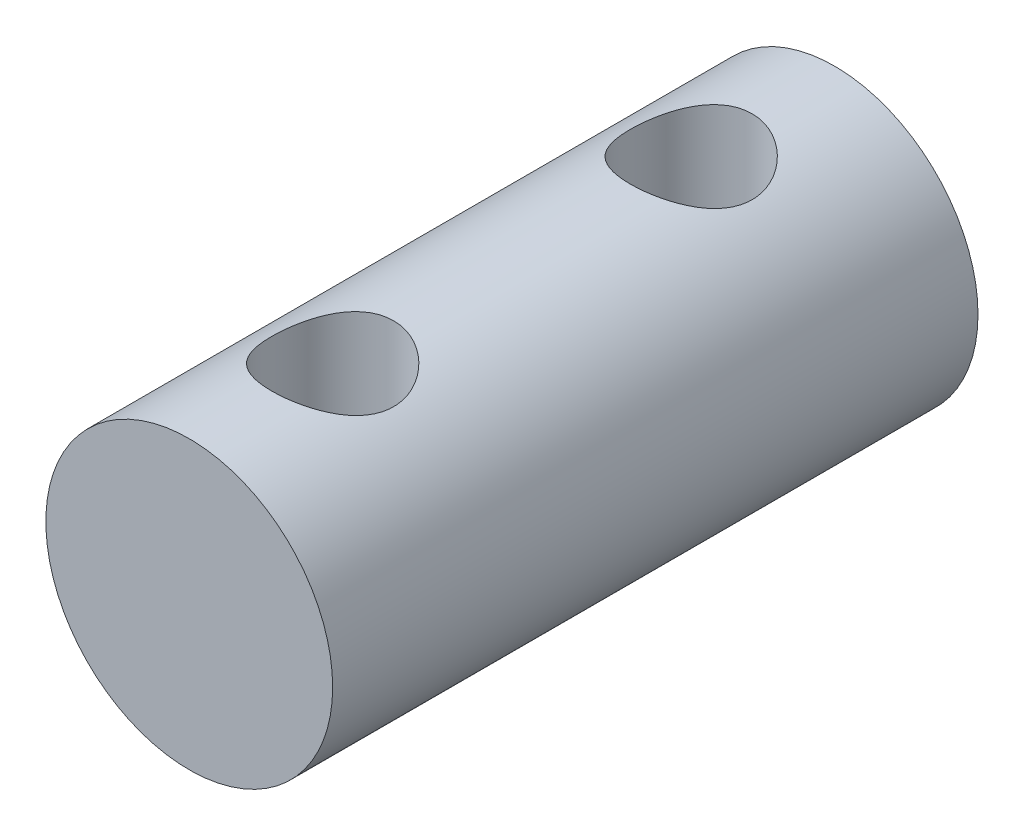
ISO-10303-21;
HEADER;
FILE_DESCRIPTION(('STEP AP214'),'2;1');
FILE_NAME('part.step','',(''),(''),'','','');
FILE_SCHEMA(('AUTOMOTIVE_DESIGN { 1 0 10303 214 1 1 1 1 }'));
ENDSEC;
DATA;
#1=APPLICATION_CONTEXT('core data for automotive mechanical design processes');
#2=APPLICATION_PROTOCOL_DEFINITION('international standard','automotive_design',2000,#1);
#3=PRODUCT_CONTEXT('',#1,'mechanical');
#4=PRODUCT('Part','Part','',(#3));
#5=PRODUCT_RELATED_PRODUCT_CATEGORY('part','',(#4));
#6=PRODUCT_DEFINITION_FORMATION('','',#4);
#7=PRODUCT_DEFINITION_CONTEXT('part definition',#1,'design');
#8=PRODUCT_DEFINITION('design','',#6,#7);
#9=PRODUCT_DEFINITION_SHAPE('','',#8);
#10=(LENGTH_UNIT() NAMED_UNIT(*) SI_UNIT(.MILLI.,.METRE.));
#11=(NAMED_UNIT(*) PLANE_ANGLE_UNIT() SI_UNIT($,.RADIAN.));
#12=(NAMED_UNIT(*) SI_UNIT($,.STERADIAN.) SOLID_ANGLE_UNIT());
#13=UNCERTAINTY_MEASURE_WITH_UNIT(LENGTH_MEASURE(1.E-05),#10,'distance_accuracy_value','');
#14=(GEOMETRIC_REPRESENTATION_CONTEXT(3) GLOBAL_UNCERTAINTY_ASSIGNED_CONTEXT((#13)) GLOBAL_UNIT_ASSIGNED_CONTEXT((#10,
#11,#12)) REPRESENTATION_CONTEXT('',''));
#15=CARTESIAN_POINT('',(0.,0.,0.));
#16=DIRECTION('',(0.,0.,1.));
#17=DIRECTION('',(1.,0.,0.));
#18=AXIS2_PLACEMENT_3D('',#15,#16,#17);
#19=CARTESIAN_POINT('',(0.,0.,18.));
#20=DIRECTION('',(0.,0.,-1.));
#21=DIRECTION('',(-1.,0.,0.));
#22=AXIS2_PLACEMENT_3D('',#19,#20,#21);
#23=CYLINDRICAL_SURFACE('',#22,4.);
#24=CARTESIAN_POINT('',(0.,-4.,15.7));
#25=CARTESIAN_POINT('',(0.0909067383912382,-3.99999220597041,15.6999897106301));
#26=CARTESIAN_POINT('',(0.181948247544875,-3.99686535628648,15.6926652180497));
#27=CARTESIAN_POINT('',(0.361443817461365,-3.98465863926745,15.6636311393432));
#28=CARTESIAN_POINT('',(0.449890675673104,-3.9755635876372,15.6418848598116));
#29=CARTESIAN_POINT('',(0.621303418382836,-3.95239600576765,15.5849624150777));
#30=CARTESIAN_POINT('',(0.704287032203665,-3.93834062442321,15.5498324870813));
#31=CARTESIAN_POINT('',(0.863099993382739,-3.90661303424537,15.4673347121455));
#32=CARTESIAN_POINT('',(0.938931339683007,-3.88894184037472,15.4199702984635));
#33=CARTESIAN_POINT('',(1.08533887118012,-3.85071852141569,15.3117595210581));
#34=CARTESIAN_POINT('',(1.15549620225715,-3.83006960280207,15.2503809742659));
#35=CARTESIAN_POINT('',(1.28488425592701,-3.78862734806511,15.1170106760215));
#36=CARTESIAN_POINT('',(1.34410900804107,-3.76783393942688,15.0450131637426));
#37=CARTESIAN_POINT('',(1.45297914161399,-3.72725158425048,14.8879432656646));
#38=CARTESIAN_POINT('',(1.50197144957215,-3.70757005023861,14.8023875229588));
#39=CARTESIAN_POINT('',(1.58468252966002,-3.67298326222159,14.6232937969467));
#40=CARTESIAN_POINT('',(1.61840948248621,-3.6580754512366,14.5297601210278));
#41=CARTESIAN_POINT('',(1.66788510104617,-3.63577599564205,14.3421874156549));
#42=CARTESIAN_POINT('',(1.68444164210522,-3.62804858539708,14.2484029755593));
#43=CARTESIAN_POINT('',(1.70162480860733,-3.62002384663305,14.0590933740614));
#44=CARTESIAN_POINT('',(1.70226073757513,-3.61972217873622,13.9635692619356));
#45=CARTESIAN_POINT('',(1.68819130162689,-3.62630002474142,13.7816927718962));
#46=CARTESIAN_POINT('',(1.6747147959927,-3.63260434164112,13.6952202789216));
#47=CARTESIAN_POINT('',(1.63487058638114,-3.65070840844882,13.5259057915921));
#48=CARTESIAN_POINT('',(1.60850029417696,-3.66250926167832,13.4430645297897));
#49=CARTESIAN_POINT('',(1.5430988475594,-3.69054609418257,13.281229181224));
#50=CARTESIAN_POINT('',(1.50380571381535,-3.70687264164878,13.2023573651418));
#51=CARTESIAN_POINT('',(1.41386001526362,-3.74210223346658,13.0520118896411));
#52=CARTESIAN_POINT('',(1.36320287222268,-3.76100631502547,12.9805412289449));
#53=CARTESIAN_POINT('',(1.2467214443949,-3.80128969459956,12.8403869615859));
#54=CARTESIAN_POINT('',(1.179953093145,-3.82274019222962,12.7725061461591));
#55=CARTESIAN_POINT('',(1.0357766835901,-3.86429704947114,12.6486294608835));
#56=CARTESIAN_POINT('',(0.958365937572639,-3.88440306762471,12.5926366024286));
#57=CARTESIAN_POINT('',(0.792578450005453,-3.92163290268784,12.4928824694364));
#58=CARTESIAN_POINT('',(0.703976692649453,-3.93867002040557,12.4494603886675));
#59=CARTESIAN_POINT('',(0.519816535420781,-3.96717150105244,12.378421998336));
#60=CARTESIAN_POINT('',(0.424262175462369,-3.97863907098317,12.3507965912606));
#61=CARTESIAN_POINT('',(0.235607210966909,-3.99410277532845,12.3138452407294));
#62=CARTESIAN_POINT('',(0.142753433781745,-3.99853766037867,12.3034427183361));
#63=CARTESIAN_POINT('',(-0.0434719300977839,-4.00084626519537,12.2980071221176));
#64=CARTESIAN_POINT('',(-0.136843351894631,-3.99872196660535,12.3029694063182));
#65=CARTESIAN_POINT('',(-0.31632812610938,-3.9884337975937,12.3273632165539));
#66=CARTESIAN_POINT('',(-0.402566216761334,-3.98059025078653,12.3460276750595));
#67=CARTESIAN_POINT('',(-0.570585652286979,-3.96000012032105,12.3962161277042));
#68=CARTESIAN_POINT('',(-0.652366438467557,-3.94725292362944,12.4277417297181));
#69=CARTESIAN_POINT('',(-0.812034318548236,-3.91757618822361,12.5037834101923));
#70=CARTESIAN_POINT('',(-0.889720370209442,-3.9005285877614,12.5486740423999));
#71=CARTESIAN_POINT('',(-1.03673648824899,-3.86405536635233,12.6497613985467));
#72=CARTESIAN_POINT('',(-1.10606298906366,-3.84462873775923,12.7059629197849));
#73=CARTESIAN_POINT('',(-1.23980420956813,-3.80369998966484,12.8329498484284));
#74=CARTESIAN_POINT('',(-1.30347271839269,-3.78215082847771,12.9045079835753));
#75=CARTESIAN_POINT('',(-1.41811853281525,-3.74067716848582,13.0576154101855));
#76=CARTESIAN_POINT('',(-1.46909251076311,-3.7207530965884,13.1391673129996));
#77=CARTESIAN_POINT('',(-1.5575812751315,-3.6845994787195,13.3118820164696));
#78=CARTESIAN_POINT('',(-1.59485563043623,-3.66843760396252,13.4031832312083));
#79=CARTESIAN_POINT('',(-1.65317215153204,-3.64253466336686,13.5916722222724));
#80=CARTESIAN_POINT('',(-1.6742284343492,-3.63278801447038,13.6888547994951));
#81=CARTESIAN_POINT('',(-1.6980817865036,-3.62169510113298,13.8780341003724));
#82=CARTESIAN_POINT('',(-1.70219594466855,-3.61974326789463,13.9698298699793));
#83=CARTESIAN_POINT('',(-1.69559342985225,-3.62284103372561,14.152756294801));
#84=CARTESIAN_POINT('',(-1.68487926513445,-3.62788944867838,14.2438870598827));
#85=CARTESIAN_POINT('',(-1.65004520545517,-3.64385594943718,14.418154377575));
#86=CARTESIAN_POINT('',(-1.62662781472624,-3.65446553868685,14.5014623813539));
#87=CARTESIAN_POINT('',(-1.56775451171664,-3.68010476578384,14.6629780659228));
#88=CARTESIAN_POINT('',(-1.5322951887417,-3.69513565573577,14.741184294223));
#89=CARTESIAN_POINT('',(-1.44784032686706,-3.72906792770947,14.8955258125194));
#90=CARTESIAN_POINT('',(-1.39814701464036,-3.74815036482766,14.9712386929264));
#91=CARTESIAN_POINT('',(-1.28759066878811,-3.78755219655615,15.1136625277544));
#92=CARTESIAN_POINT('',(-1.22672351574411,-3.80787204550609,15.1803701464476));
#93=CARTESIAN_POINT('',(-1.08998592064412,-3.84933921665509,15.308184663993));
#94=CARTESIAN_POINT('',(-1.01332080388046,-3.87042965397422,15.3684639434664));
#95=CARTESIAN_POINT('',(-0.850192328366723,-3.90950085981833,15.4753572184503));
#96=CARTESIAN_POINT('',(-0.763724549019843,-3.92748021606687,15.521965014425));
#97=CARTESIAN_POINT('',(-0.584638322061837,-3.95807109121892,15.5992398277168));
#98=CARTESIAN_POINT('',(-0.492133369486678,-3.97076006232551,15.6301384218695));
#99=CARTESIAN_POINT('',(-0.302747237251516,-3.98965231477193,15.6756391142457));
#100=CARTESIAN_POINT('',(-0.205880644982406,-3.99587575072494,15.6902918642927));
#101=CARTESIAN_POINT('',(-0.0724124000644841,-3.9995111552704,15.6988472918178));
#102=CARTESIAN_POINT('',(-0.0362168954062223,-4.00000310511145,15.7000040992454));
#103=CARTESIAN_POINT('',(0.,-4.,15.7));
#104=B_SPLINE_CURVE_WITH_KNOTS('',3,(#24,#25,#26,#27,#28,#29,#30,#31,#32,#33,#34,#35,#36,#37,
#38,#39,#40,#41,#42,#43,#44,#45,#46,#47,#48,#49,#50,#51,#52,#53,#54,#55,#56,#57,#58,#59,#60,#61,
#62,#63,#64,#65,#66,#67,#68,#69,#70,#71,#72,#73,#74,#75,#76,#77,#78,#79,#80,#81,#82,#83,#84,#85,
#86,#87,#88,#89,#90,#91,#92,#93,#94,#95,#96,#97,#98,#99,#100,#101,#102,#103),.UNSPECIFIED.,.T.,
.F.,(4,2,2,2,2,2,2,2,2,2,2,2,2,2,2,2,2,2,2,2,2,2,2,2,2,2,2,2,2,2,2,2,2,2,2,2,2,2,2,4),(0.,
0.272614080586948,0.545924448955115,0.818299036258468,1.0905972723283,1.37578897563167,
1.6611359694513,1.96122665765481,2.26115633643809,2.54622741570577,2.83113190415595,
3.09313885870025,3.35519842866463,3.62293686689447,3.89078336358892,4.18227106535257,
4.47383251736207,4.77265212568181,5.07129946606979,5.35045690028007,5.62953000442511,
5.89406804870765,6.15863917515647,6.43146346064616,6.70440370416334,6.99759736979758,
7.29086781033873,7.589063837357,7.88700000529106,8.16127896953774,8.4355115441941,
8.69592961746399,8.95642151179745,9.23291696910161,9.5095145664191,9.80742506459498,
10.1054704465792,10.3989846098609,10.691581048933,10.80018945154),.UNSPECIFIED.);
#105=CARTESIAN_POINT('',(0.,-4.,15.7));
#106=VERTEX_POINT('',#105);
#107=EDGE_CURVE('E32',#106,#106,#104,.T.);
#108=ORIENTED_EDGE('',*,*,#107,.T.);
#109=EDGE_LOOP('',(#108));
#110=FACE_BOUND('',#109,.T.);
#111=CARTESIAN_POINT('',(0.,4.,15.7));
#112=CARTESIAN_POINT('',(-0.0909067383912382,3.99999220597041,15.6999897106301));
#113=CARTESIAN_POINT('',(-0.181948247544875,3.99686535628648,15.6926652180497));
#114=CARTESIAN_POINT('',(-0.361443817461365,3.98465863926745,15.6636311393432));
#115=CARTESIAN_POINT('',(-0.449890675673104,3.9755635876372,15.6418848598116));
#116=CARTESIAN_POINT('',(-0.621303418382836,3.95239600576765,15.5849624150777));
#117=CARTESIAN_POINT('',(-0.704287032203665,3.93834062442321,15.5498324870813));
#118=CARTESIAN_POINT('',(-0.863099993382739,3.90661303424537,15.4673347121455));
#119=CARTESIAN_POINT('',(-0.938931339683007,3.88894184037472,15.4199702984635));
#120=CARTESIAN_POINT('',(-1.08533887118012,3.85071852141569,15.3117595210581));
#121=CARTESIAN_POINT('',(-1.15549620225715,3.83006960280207,15.2503809742659));
#122=CARTESIAN_POINT('',(-1.28488425592701,3.78862734806511,15.1170106760215));
#123=CARTESIAN_POINT('',(-1.34410900804107,3.76783393942688,15.0450131637426));
#124=CARTESIAN_POINT('',(-1.45297914161399,3.72725158425048,14.8879432656646));
#125=CARTESIAN_POINT('',(-1.50197144957215,3.70757005023861,14.8023875229588));
#126=CARTESIAN_POINT('',(-1.58468252966002,3.67298326222159,14.6232937969467));
#127=CARTESIAN_POINT('',(-1.61840948248621,3.6580754512366,14.5297601210278));
#128=CARTESIAN_POINT('',(-1.66788510104617,3.63577599564205,14.3421874156549));
#129=CARTESIAN_POINT('',(-1.68444164210522,3.62804858539708,14.2484029755593));
#130=CARTESIAN_POINT('',(-1.70162480860733,3.62002384663305,14.0590933740614));
#131=CARTESIAN_POINT('',(-1.70226073757513,3.61972217873622,13.9635692619356));
#132=CARTESIAN_POINT('',(-1.68819130162689,3.62630002474142,13.7816927718962));
#133=CARTESIAN_POINT('',(-1.6747147959927,3.63260434164112,13.6952202789216));
#134=CARTESIAN_POINT('',(-1.63487058638114,3.65070840844882,13.5259057915921));
#135=CARTESIAN_POINT('',(-1.60850029417696,3.66250926167832,13.4430645297897));
#136=CARTESIAN_POINT('',(-1.5430988475594,3.69054609418257,13.281229181224));
#137=CARTESIAN_POINT('',(-1.50380571381535,3.70687264164878,13.2023573651418));
#138=CARTESIAN_POINT('',(-1.41386001526362,3.74210223346658,13.0520118896411));
#139=CARTESIAN_POINT('',(-1.36320287222268,3.76100631502547,12.9805412289449));
#140=CARTESIAN_POINT('',(-1.2467214443949,3.80128969459956,12.8403869615859));
#141=CARTESIAN_POINT('',(-1.179953093145,3.82274019222962,12.7725061461591));
#142=CARTESIAN_POINT('',(-1.0357766835901,3.86429704947114,12.6486294608835));
#143=CARTESIAN_POINT('',(-0.958365937572639,3.88440306762471,12.5926366024286));
#144=CARTESIAN_POINT('',(-0.792578450005453,3.92163290268784,12.4928824694364));
#145=CARTESIAN_POINT('',(-0.703976692649453,3.93867002040557,12.4494603886675));
#146=CARTESIAN_POINT('',(-0.519816535420781,3.96717150105244,12.378421998336));
#147=CARTESIAN_POINT('',(-0.424262175462369,3.97863907098317,12.3507965912606));
#148=CARTESIAN_POINT('',(-0.235607210966909,3.99410277532845,12.3138452407294));
#149=CARTESIAN_POINT('',(-0.142753433781745,3.99853766037867,12.3034427183361));
#150=CARTESIAN_POINT('',(0.0434719300977839,4.00084626519537,12.2980071221176));
#151=CARTESIAN_POINT('',(0.136843351894631,3.99872196660535,12.3029694063182));
#152=CARTESIAN_POINT('',(0.31632812610938,3.9884337975937,12.3273632165539));
#153=CARTESIAN_POINT('',(0.402566216761334,3.98059025078653,12.3460276750595));
#154=CARTESIAN_POINT('',(0.570585652286979,3.96000012032105,12.3962161277042));
#155=CARTESIAN_POINT('',(0.652366438467557,3.94725292362944,12.4277417297181));
#156=CARTESIAN_POINT('',(0.812034318548236,3.91757618822361,12.5037834101923));
#157=CARTESIAN_POINT('',(0.889720370209442,3.9005285877614,12.5486740423999));
#158=CARTESIAN_POINT('',(1.03673648824899,3.86405536635233,12.6497613985467));
#159=CARTESIAN_POINT('',(1.10606298906366,3.84462873775923,12.7059629197849));
#160=CARTESIAN_POINT('',(1.23980420956813,3.80369998966484,12.8329498484284));
#161=CARTESIAN_POINT('',(1.30347271839269,3.78215082847771,12.9045079835753));
#162=CARTESIAN_POINT('',(1.41811853281525,3.74067716848582,13.0576154101855));
#163=CARTESIAN_POINT('',(1.46909251076311,3.7207530965884,13.1391673129996));
#164=CARTESIAN_POINT('',(1.5575812751315,3.6845994787195,13.3118820164696));
#165=CARTESIAN_POINT('',(1.59485563043623,3.66843760396252,13.4031832312083));
#166=CARTESIAN_POINT('',(1.65317215153204,3.64253466336686,13.5916722222724));
#167=CARTESIAN_POINT('',(1.6742284343492,3.63278801447038,13.6888547994951));
#168=CARTESIAN_POINT('',(1.6980817865036,3.62169510113298,13.8780341003724));
#169=CARTESIAN_POINT('',(1.70219594466855,3.61974326789463,13.9698298699793));
#170=CARTESIAN_POINT('',(1.69559342985225,3.62284103372561,14.152756294801));
#171=CARTESIAN_POINT('',(1.68487926513445,3.62788944867838,14.2438870598827));
#172=CARTESIAN_POINT('',(1.65004520545517,3.64385594943718,14.418154377575));
#173=CARTESIAN_POINT('',(1.62662781472624,3.65446553868685,14.5014623813539));
#174=CARTESIAN_POINT('',(1.56775451171664,3.68010476578384,14.6629780659228));
#175=CARTESIAN_POINT('',(1.5322951887417,3.69513565573577,14.741184294223));
#176=CARTESIAN_POINT('',(1.44784032686706,3.72906792770947,14.8955258125194));
#177=CARTESIAN_POINT('',(1.39814701464036,3.74815036482766,14.9712386929264));
#178=CARTESIAN_POINT('',(1.28759066878811,3.78755219655615,15.1136625277544));
#179=CARTESIAN_POINT('',(1.22672351574411,3.80787204550609,15.1803701464476));
#180=CARTESIAN_POINT('',(1.08998592064412,3.84933921665509,15.308184663993));
#181=CARTESIAN_POINT('',(1.01332080388046,3.87042965397422,15.3684639434664));
#182=CARTESIAN_POINT('',(0.850192328366723,3.90950085981833,15.4753572184503));
#183=CARTESIAN_POINT('',(0.763724549019843,3.92748021606687,15.521965014425));
#184=CARTESIAN_POINT('',(0.584638322061837,3.95807109121892,15.5992398277168));
#185=CARTESIAN_POINT('',(0.492133369486678,3.97076006232551,15.6301384218695));
#186=CARTESIAN_POINT('',(0.302747237251516,3.98965231477193,15.6756391142457));
#187=CARTESIAN_POINT('',(0.205880644982406,3.99587575072494,15.6902918642927));
#188=CARTESIAN_POINT('',(0.0724124000644841,3.9995111552704,15.6988472918178));
#189=CARTESIAN_POINT('',(0.0362168954062223,4.00000310511145,15.7000040992454));
#190=CARTESIAN_POINT('',(0.,4.,15.7));
#191=B_SPLINE_CURVE_WITH_KNOTS('',3,(#111,#112,#113,#114,#115,#116,#117,#118,#119,#120,#121,
#122,#123,#124,#125,#126,#127,#128,#129,#130,#131,#132,#133,#134,#135,#136,#137,#138,#139,#140,
#141,#142,#143,#144,#145,#146,#147,#148,#149,#150,#151,#152,#153,#154,#155,#156,#157,#158,#159,
#160,#161,#162,#163,#164,#165,#166,#167,#168,#169,#170,#171,#172,#173,#174,#175,#176,#177,#178,
#179,#180,#181,#182,#183,#184,#185,#186,#187,#188,#189,#190),.UNSPECIFIED.,.T.,.F.,(4,2,2,2,2,2,
2,2,2,2,2,2,2,2,2,2,2,2,2,2,2,2,2,2,2,2,2,2,2,2,2,2,2,2,2,2,2,2,2,4),(0.,0.272614080586948,
0.545924448955115,0.818299036258468,1.0905972723283,1.37578897563167,1.6611359694513,
1.96122665765481,2.26115633643809,2.54622741570577,2.83113190415595,3.09313885870025,
3.35519842866463,3.62293686689447,3.89078336358892,4.18227106535257,4.47383251736207,
4.77265212568181,5.07129946606979,5.35045690028007,5.62953000442511,5.89406804870765,
6.15863917515647,6.43146346064616,6.70440370416334,6.99759736979758,7.29086781033873,
7.589063837357,7.88700000529106,8.16127896953774,8.4355115441941,8.69592961746399,
8.95642151179745,9.23291696910161,9.5095145664191,9.80742506459498,10.1054704465792,
10.3989846098609,10.691581048933,10.80018945154),.UNSPECIFIED.);
#192=CARTESIAN_POINT('',(0.,4.,15.7));
#193=VERTEX_POINT('',#192);
#194=EDGE_CURVE('E80',#193,#193,#191,.T.);
#195=ORIENTED_EDGE('',*,*,#194,.T.);
#196=EDGE_LOOP('',(#195));
#197=FACE_BOUND('',#196,.T.);
#198=CARTESIAN_POINT('',(0.,-4.,5.7));
#199=CARTESIAN_POINT('',(0.0909067383912385,-3.99999220597041,5.69998971063012));
#200=CARTESIAN_POINT('',(0.181948247544875,-3.99686535628648,5.69266521804974));
#201=CARTESIAN_POINT('',(0.361443817461365,-3.98465863926745,5.66363113934321));
#202=CARTESIAN_POINT('',(0.449890675673104,-3.9755635876372,5.64188485981159));
#203=CARTESIAN_POINT('',(0.621303418382836,-3.95239600576765,5.58496241507771));
#204=CARTESIAN_POINT('',(0.704287032203665,-3.93834062442321,5.54983248708134));
#205=CARTESIAN_POINT('',(0.863099993382739,-3.90661303424537,5.4673347121455));
#206=CARTESIAN_POINT('',(0.938931339683007,-3.88894184037472,5.41997029846346));
#207=CARTESIAN_POINT('',(1.08533887118012,-3.85071852141569,5.31175952105814));
#208=CARTESIAN_POINT('',(1.15549620225715,-3.83006960280207,5.25038097426594));
#209=CARTESIAN_POINT('',(1.28488425592701,-3.78862734806511,5.11701067602155));
#210=CARTESIAN_POINT('',(1.34410900804107,-3.76783393942688,5.04501316374257));
#211=CARTESIAN_POINT('',(1.45297914161399,-3.72725158425048,4.88794326566456));
#212=CARTESIAN_POINT('',(1.50197144957215,-3.70757005023861,4.8023875229588));
#213=CARTESIAN_POINT('',(1.58468252966003,-3.67298326222159,4.62329379694671));
#214=CARTESIAN_POINT('',(1.61840948248621,-3.6580754512366,4.52976012102782));
#215=CARTESIAN_POINT('',(1.66788510104617,-3.63577599564205,4.34218741565488));
#216=CARTESIAN_POINT('',(1.68444164210522,-3.62804858539708,4.24840297555926));
#217=CARTESIAN_POINT('',(1.70162480860733,-3.62002384663305,4.05909337406137));
#218=CARTESIAN_POINT('',(1.70226073757513,-3.61972217873622,3.96356926193557));
#219=CARTESIAN_POINT('',(1.68819130162689,-3.62630002474142,3.78169277189617));
#220=CARTESIAN_POINT('',(1.6747147959927,-3.63260434164112,3.69522027892165));
#221=CARTESIAN_POINT('',(1.63487058638114,-3.65070840844882,3.52590579159212));
#222=CARTESIAN_POINT('',(1.60850029417696,-3.66250926167832,3.44306452978975));
#223=CARTESIAN_POINT('',(1.5430988475594,-3.69054609418257,3.28122918122404));
#224=CARTESIAN_POINT('',(1.50380571381535,-3.70687264164878,3.20235736514182));
#225=CARTESIAN_POINT('',(1.41386001526362,-3.74210223346658,3.05201188964113));
#226=CARTESIAN_POINT('',(1.36320287222268,-3.76100631502547,2.98054122894492));
#227=CARTESIAN_POINT('',(1.2467214443949,-3.80128969459956,2.84038696158588));
#228=CARTESIAN_POINT('',(1.179953093145,-3.82274019222962,2.77250614615909));
#229=CARTESIAN_POINT('',(1.0357766835901,-3.86429704947114,2.64862946088348));
#230=CARTESIAN_POINT('',(0.958365937572639,-3.88440306762471,2.59263660242861));
#231=CARTESIAN_POINT('',(0.792578450005453,-3.92163290268784,2.49288246943645));
#232=CARTESIAN_POINT('',(0.703976692649453,-3.93867002040557,2.44946038866755));
#233=CARTESIAN_POINT('',(0.519816535420781,-3.96717150105244,2.37842199833598));
#234=CARTESIAN_POINT('',(0.424262175462369,-3.97863907098317,2.35079659126056));
#235=CARTESIAN_POINT('',(0.235607210966909,-3.99410277532845,2.31384524072936));
#236=CARTESIAN_POINT('',(0.142753433781745,-3.99853766037867,2.3034427183361));
#237=CARTESIAN_POINT('',(-0.0434719300977838,-4.00084626519537,2.29800712211759));
#238=CARTESIAN_POINT('',(-0.136843351894631,-3.99872196660535,2.3029694063182));
#239=CARTESIAN_POINT('',(-0.31632812610938,-3.9884337975937,2.32736321655387));
#240=CARTESIAN_POINT('',(-0.402566216761333,-3.98059025078653,2.34602767505951));
#241=CARTESIAN_POINT('',(-0.570585652286979,-3.96000012032105,2.39621612770418));
#242=CARTESIAN_POINT('',(-0.652366438467557,-3.94725292362944,2.42774172971809));
#243=CARTESIAN_POINT('',(-0.812034318548236,-3.91757618822361,2.50378341019227));
#244=CARTESIAN_POINT('',(-0.889720370209442,-3.9005285877614,2.54867404239986));
#245=CARTESIAN_POINT('',(-1.03673648824899,-3.86405536635233,2.64976139854671));
#246=CARTESIAN_POINT('',(-1.10606298906366,-3.84462873775923,2.70596291978486));
#247=CARTESIAN_POINT('',(-1.23980420956813,-3.80369998966484,2.8329498484284));
#248=CARTESIAN_POINT('',(-1.30347271839269,-3.78215082847771,2.90450798357526));
#249=CARTESIAN_POINT('',(-1.41811853281525,-3.74067716848582,3.05761541018552));
#250=CARTESIAN_POINT('',(-1.46909251076311,-3.7207530965884,3.13916731299962));
#251=CARTESIAN_POINT('',(-1.5575812751315,-3.6845994787195,3.31188201646957));
#252=CARTESIAN_POINT('',(-1.59485563043623,-3.66843760396252,3.40318323120828));
#253=CARTESIAN_POINT('',(-1.65317215153204,-3.64253466336686,3.59167222227236));
#254=CARTESIAN_POINT('',(-1.6742284343492,-3.63278801447038,3.68885479949513));
#255=CARTESIAN_POINT('',(-1.6980817865036,-3.62169510113298,3.87803410037236));
#256=CARTESIAN_POINT('',(-1.70219594466855,-3.61974326789463,3.9698298699793));
#257=CARTESIAN_POINT('',(-1.69559342985225,-3.62284103372561,4.15275629480105));
#258=CARTESIAN_POINT('',(-1.68487926513445,-3.62788944867838,4.24388705988267));
#259=CARTESIAN_POINT('',(-1.65004520545517,-3.64385594943718,4.41815437757505));
#260=CARTESIAN_POINT('',(-1.62662781472624,-3.65446553868685,4.50146238135394));
#261=CARTESIAN_POINT('',(-1.56775451171664,-3.68010476578384,4.66297806592282));
#262=CARTESIAN_POINT('',(-1.5322951887417,-3.69513565573577,4.74118429422305));
#263=CARTESIAN_POINT('',(-1.44784032686706,-3.72906792770947,4.89552581251936));
#264=CARTESIAN_POINT('',(-1.39814701464036,-3.74815036482766,4.97123869292639));
#265=CARTESIAN_POINT('',(-1.28759066878811,-3.78755219655615,5.11366252775445));
#266=CARTESIAN_POINT('',(-1.22672351574411,-3.80787204550609,5.18037014644764));
#267=CARTESIAN_POINT('',(-1.08998592064412,-3.84933921665509,5.30818466399305));
#268=CARTESIAN_POINT('',(-1.01332080388046,-3.87042965397422,5.36846394346638));
#269=CARTESIAN_POINT('',(-0.850192328366723,-3.90950085981833,5.47535721845034));
#270=CARTESIAN_POINT('',(-0.763724549019843,-3.92748021606687,5.521965014425));
#271=CARTESIAN_POINT('',(-0.584638322061838,-3.95807109121892,5.59923982771681));
#272=CARTESIAN_POINT('',(-0.492133369486679,-3.97076006232551,5.63013842186949));
#273=CARTESIAN_POINT('',(-0.302747237251518,-3.98965231477193,5.67563911424574));
#274=CARTESIAN_POINT('',(-0.205880644982408,-3.99587575072494,5.69029186429268));
#275=CARTESIAN_POINT('',(-0.0724124000644846,-3.99951115527041,5.69884729181778));
#276=CARTESIAN_POINT('',(-0.0362168954062226,-4.00000310511145,5.70000409924544));
#277=CARTESIAN_POINT('',(0.,-4.,5.7));
#278=B_SPLINE_CURVE_WITH_KNOTS('',3,(#198,#199,#200,#201,#202,#203,#204,#205,#206,#207,#208,
#209,#210,#211,#212,#213,#214,#215,#216,#217,#218,#219,#220,#221,#222,#223,#224,#225,#226,#227,
#228,#229,#230,#231,#232,#233,#234,#235,#236,#237,#238,#239,#240,#241,#242,#243,#244,#245,#246,
#247,#248,#249,#250,#251,#252,#253,#254,#255,#256,#257,#258,#259,#260,#261,#262,#263,#264,#265,
#266,#267,#268,#269,#270,#271,#272,#273,#274,#275,#276,#277),.UNSPECIFIED.,.T.,.F.,(4,2,2,2,2,2,
2,2,2,2,2,2,2,2,2,2,2,2,2,2,2,2,2,2,2,2,2,2,2,2,2,2,2,2,2,2,2,2,2,4),(0.,0.272614080586949,
0.545924448955116,0.818299036258468,1.0905972723283,1.37578897563167,1.6611359694513,
1.96122665765481,2.26115633643809,2.54622741570577,2.83113190415595,3.09313885870026,
3.35519842866463,3.62293686689446,3.89078336358892,4.18227106535257,4.47383251736207,
4.77265212568181,5.07129946606979,5.35045690028007,5.62953000442511,5.89406804870765,
6.15863917515647,6.43146346064616,6.70440370416334,6.99759736979759,7.29086781033873,
7.589063837357,7.88700000529106,8.16127896953774,8.43551154419409,8.69592961746398,
8.95642151179745,9.23291696910161,9.5095145664191,9.80742506459498,10.1054704465792,
10.3989846098609,10.691581048933,10.80018945154),.UNSPECIFIED.);
#279=CARTESIAN_POINT('',(0.,-4.,5.7));
#280=VERTEX_POINT('',#279);
#281=EDGE_CURVE('E44',#280,#280,#278,.T.);
#282=ORIENTED_EDGE('',*,*,#281,.T.);
#283=EDGE_LOOP('',(#282));
#284=FACE_BOUND('',#283,.T.);
#285=CARTESIAN_POINT('',(0.,4.,5.7));
#286=CARTESIAN_POINT('',(-0.0909067383912385,3.99999220597041,5.69998971063012));
#287=CARTESIAN_POINT('',(-0.181948247544875,3.99686535628648,5.69266521804974));
#288=CARTESIAN_POINT('',(-0.361443817461365,3.98465863926745,5.66363113934321));
#289=CARTESIAN_POINT('',(-0.449890675673104,3.9755635876372,5.64188485981159));
#290=CARTESIAN_POINT('',(-0.621303418382836,3.95239600576765,5.58496241507771));
#291=CARTESIAN_POINT('',(-0.704287032203665,3.93834062442321,5.54983248708134));
#292=CARTESIAN_POINT('',(-0.863099993382739,3.90661303424537,5.4673347121455));
#293=CARTESIAN_POINT('',(-0.938931339683007,3.88894184037472,5.41997029846346));
#294=CARTESIAN_POINT('',(-1.08533887118012,3.85071852141569,5.31175952105814));
#295=CARTESIAN_POINT('',(-1.15549620225715,3.83006960280207,5.25038097426594));
#296=CARTESIAN_POINT('',(-1.28488425592701,3.78862734806511,5.11701067602155));
#297=CARTESIAN_POINT('',(-1.34410900804107,3.76783393942688,5.04501316374257));
#298=CARTESIAN_POINT('',(-1.45297914161399,3.72725158425048,4.88794326566456));
#299=CARTESIAN_POINT('',(-1.50197144957215,3.70757005023861,4.8023875229588));
#300=CARTESIAN_POINT('',(-1.58468252966003,3.67298326222159,4.62329379694671));
#301=CARTESIAN_POINT('',(-1.61840948248621,3.6580754512366,4.52976012102782));
#302=CARTESIAN_POINT('',(-1.66788510104617,3.63577599564205,4.34218741565488));
#303=CARTESIAN_POINT('',(-1.68444164210522,3.62804858539708,4.24840297555926));
#304=CARTESIAN_POINT('',(-1.70162480860733,3.62002384663305,4.05909337406137));
#305=CARTESIAN_POINT('',(-1.70226073757513,3.61972217873622,3.96356926193557));
#306=CARTESIAN_POINT('',(-1.68819130162689,3.62630002474142,3.78169277189617));
#307=CARTESIAN_POINT('',(-1.6747147959927,3.63260434164112,3.69522027892165));
#308=CARTESIAN_POINT('',(-1.63487058638114,3.65070840844882,3.52590579159212));
#309=CARTESIAN_POINT('',(-1.60850029417696,3.66250926167832,3.44306452978975));
#310=CARTESIAN_POINT('',(-1.5430988475594,3.69054609418257,3.28122918122404));
#311=CARTESIAN_POINT('',(-1.50380571381535,3.70687264164878,3.20235736514182));
#312=CARTESIAN_POINT('',(-1.41386001526362,3.74210223346658,3.05201188964113));
#313=CARTESIAN_POINT('',(-1.36320287222268,3.76100631502547,2.98054122894492));
#314=CARTESIAN_POINT('',(-1.2467214443949,3.80128969459956,2.84038696158588));
#315=CARTESIAN_POINT('',(-1.179953093145,3.82274019222962,2.77250614615909));
#316=CARTESIAN_POINT('',(-1.0357766835901,3.86429704947114,2.64862946088348));
#317=CARTESIAN_POINT('',(-0.958365937572639,3.88440306762471,2.59263660242861));
#318=CARTESIAN_POINT('',(-0.792578450005453,3.92163290268784,2.49288246943645));
#319=CARTESIAN_POINT('',(-0.703976692649453,3.93867002040557,2.44946038866755));
#320=CARTESIAN_POINT('',(-0.519816535420781,3.96717150105244,2.37842199833598));
#321=CARTESIAN_POINT('',(-0.424262175462369,3.97863907098317,2.35079659126056));
#322=CARTESIAN_POINT('',(-0.235607210966909,3.99410277532845,2.31384524072936));
#323=CARTESIAN_POINT('',(-0.142753433781745,3.99853766037867,2.3034427183361));
#324=CARTESIAN_POINT('',(0.0434719300977838,4.00084626519537,2.29800712211759));
#325=CARTESIAN_POINT('',(0.136843351894631,3.99872196660535,2.3029694063182));
#326=CARTESIAN_POINT('',(0.31632812610938,3.9884337975937,2.32736321655387));
#327=CARTESIAN_POINT('',(0.402566216761333,3.98059025078653,2.34602767505951));
#328=CARTESIAN_POINT('',(0.570585652286979,3.96000012032105,2.39621612770418));
#329=CARTESIAN_POINT('',(0.652366438467557,3.94725292362944,2.42774172971809));
#330=CARTESIAN_POINT('',(0.812034318548236,3.91757618822361,2.50378341019227));
#331=CARTESIAN_POINT('',(0.889720370209442,3.9005285877614,2.54867404239986));
#332=CARTESIAN_POINT('',(1.03673648824899,3.86405536635233,2.64976139854671));
#333=CARTESIAN_POINT('',(1.10606298906366,3.84462873775923,2.70596291978486));
#334=CARTESIAN_POINT('',(1.23980420956813,3.80369998966484,2.8329498484284));
#335=CARTESIAN_POINT('',(1.30347271839269,3.78215082847771,2.90450798357526));
#336=CARTESIAN_POINT('',(1.41811853281525,3.74067716848582,3.05761541018552));
#337=CARTESIAN_POINT('',(1.46909251076311,3.7207530965884,3.13916731299962));
#338=CARTESIAN_POINT('',(1.5575812751315,3.6845994787195,3.31188201646957));
#339=CARTESIAN_POINT('',(1.59485563043623,3.66843760396252,3.40318323120828));
#340=CARTESIAN_POINT('',(1.65317215153204,3.64253466336686,3.59167222227236));
#341=CARTESIAN_POINT('',(1.6742284343492,3.63278801447038,3.68885479949513));
#342=CARTESIAN_POINT('',(1.6980817865036,3.62169510113298,3.87803410037236));
#343=CARTESIAN_POINT('',(1.70219594466855,3.61974326789463,3.9698298699793));
#344=CARTESIAN_POINT('',(1.69559342985225,3.62284103372561,4.15275629480105));
#345=CARTESIAN_POINT('',(1.68487926513445,3.62788944867838,4.24388705988267));
#346=CARTESIAN_POINT('',(1.65004520545517,3.64385594943718,4.41815437757505));
#347=CARTESIAN_POINT('',(1.62662781472624,3.65446553868685,4.50146238135394));
#348=CARTESIAN_POINT('',(1.56775451171664,3.68010476578384,4.66297806592282));
#349=CARTESIAN_POINT('',(1.5322951887417,3.69513565573577,4.74118429422305));
#350=CARTESIAN_POINT('',(1.44784032686706,3.72906792770947,4.89552581251936));
#351=CARTESIAN_POINT('',(1.39814701464036,3.74815036482766,4.97123869292639));
#352=CARTESIAN_POINT('',(1.28759066878811,3.78755219655615,5.11366252775445));
#353=CARTESIAN_POINT('',(1.22672351574411,3.80787204550609,5.18037014644764));
#354=CARTESIAN_POINT('',(1.08998592064412,3.84933921665509,5.30818466399305));
#355=CARTESIAN_POINT('',(1.01332080388046,3.87042965397422,5.36846394346638));
#356=CARTESIAN_POINT('',(0.850192328366723,3.90950085981833,5.47535721845034));
#357=CARTESIAN_POINT('',(0.763724549019843,3.92748021606687,5.521965014425));
#358=CARTESIAN_POINT('',(0.584638322061838,3.95807109121892,5.59923982771681));
#359=CARTESIAN_POINT('',(0.492133369486679,3.97076006232551,5.63013842186949));
#360=CARTESIAN_POINT('',(0.302747237251518,3.98965231477193,5.67563911424574));
#361=CARTESIAN_POINT('',(0.205880644982408,3.99587575072494,5.69029186429268));
#362=CARTESIAN_POINT('',(0.0724124000644846,3.99951115527041,5.69884729181778));
#363=CARTESIAN_POINT('',(0.0362168954062226,4.00000310511145,5.70000409924544));
#364=CARTESIAN_POINT('',(0.,4.,5.7));
#365=B_SPLINE_CURVE_WITH_KNOTS('',3,(#285,#286,#287,#288,#289,#290,#291,#292,#293,#294,#295,
#296,#297,#298,#299,#300,#301,#302,#303,#304,#305,#306,#307,#308,#309,#310,#311,#312,#313,#314,
#315,#316,#317,#318,#319,#320,#321,#322,#323,#324,#325,#326,#327,#328,#329,#330,#331,#332,#333,
#334,#335,#336,#337,#338,#339,#340,#341,#342,#343,#344,#345,#346,#347,#348,#349,#350,#351,#352,
#353,#354,#355,#356,#357,#358,#359,#360,#361,#362,#363,#364),.UNSPECIFIED.,.T.,.F.,(4,2,2,2,2,2,
2,2,2,2,2,2,2,2,2,2,2,2,2,2,2,2,2,2,2,2,2,2,2,2,2,2,2,2,2,2,2,2,2,4),(0.,0.272614080586949,
0.545924448955116,0.818299036258468,1.0905972723283,1.37578897563167,1.6611359694513,
1.96122665765481,2.26115633643809,2.54622741570577,2.83113190415595,3.09313885870026,
3.35519842866463,3.62293686689446,3.89078336358892,4.18227106535257,4.47383251736207,
4.77265212568181,5.07129946606979,5.35045690028007,5.62953000442511,5.89406804870765,
6.15863917515647,6.43146346064616,6.70440370416334,6.99759736979759,7.29086781033873,
7.589063837357,7.88700000529106,8.16127896953774,8.43551154419409,8.69592961746398,
8.95642151179745,9.23291696910161,9.5095145664191,9.80742506459498,10.1054704465792,
10.3989846098609,10.691581048933,10.80018945154),.UNSPECIFIED.);
#366=CARTESIAN_POINT('',(0.,4.,5.7));
#367=VERTEX_POINT('',#366);
#368=EDGE_CURVE('E47',#367,#367,#365,.T.);
#369=ORIENTED_EDGE('',*,*,#368,.T.);
#370=EDGE_LOOP('',(#369));
#371=FACE_BOUND('',#370,.T.);
#372=CARTESIAN_POINT('',(0.,0.,18.));
#373=DIRECTION('',(0.,0.,1.));
#374=DIRECTION('',(1.,0.,0.));
#375=AXIS2_PLACEMENT_3D('',#372,#373,#374);
#376=CIRCLE('',#375,4.);
#377=CARTESIAN_POINT('',(4.,0.,18.));
#378=VERTEX_POINT('',#377);
#379=EDGE_CURVE('E10',#378,#378,#376,.T.);
#380=ORIENTED_EDGE('',*,*,#379,.F.);
#381=EDGE_LOOP('',(#380));
#382=FACE_BOUND('',#381,.T.);
#383=CARTESIAN_POINT('',(0.,0.,0.));
#384=DIRECTION('',(0.,0.,1.));
#385=DIRECTION('',(1.,0.,0.));
#386=AXIS2_PLACEMENT_3D('',#383,#384,#385);
#387=CIRCLE('',#386,4.);
#388=CARTESIAN_POINT('',(4.,0.,0.));
#389=VERTEX_POINT('',#388);
#390=EDGE_CURVE('E39',#389,#389,#387,.T.);
#391=ORIENTED_EDGE('',*,*,#390,.T.);
#392=EDGE_LOOP('',(#391));
#393=FACE_BOUND('',#392,.T.);
#394=ADVANCED_FACE('F28',(#110,#197,#284,#371,#382,#393),#23,.T.);
#395=CARTESIAN_POINT('',(0.,0.,18.));
#396=DIRECTION('',(0.,0.,1.));
#397=DIRECTION('',(1.,0.,0.));
#398=AXIS2_PLACEMENT_3D('',#395,#396,#397);
#399=PLANE('',#398);
#400=ORIENTED_EDGE('',*,*,#379,.T.);
#401=EDGE_LOOP('',(#400));
#402=FACE_BOUND('',#401,.T.);
#403=ADVANCED_FACE('F65',(#402),#399,.T.);
#404=CARTESIAN_POINT('',(0.,0.,0.));
#405=DIRECTION('',(0.,0.,1.));
#406=DIRECTION('',(1.,0.,0.));
#407=AXIS2_PLACEMENT_3D('',#404,#405,#406);
#408=PLANE('',#407);
#409=ORIENTED_EDGE('',*,*,#390,.F.);
#410=EDGE_LOOP('',(#409));
#411=FACE_BOUND('',#410,.T.);
#412=ADVANCED_FACE('F60',(#411),#408,.F.);
#413=CARTESIAN_POINT('',(0.,-10.,4.));
#414=DIRECTION('',(0.,1.,0.));
#415=DIRECTION('',(0.,0.,1.));
#416=AXIS2_PLACEMENT_3D('',#413,#414,#415);
#417=CYLINDRICAL_SURFACE('',#416,1.7);
#418=ORIENTED_EDGE('',*,*,#368,.F.);
#419=EDGE_LOOP('',(#418));
#420=FACE_BOUND('',#419,.T.);
#421=ORIENTED_EDGE('',*,*,#281,.F.);
#422=EDGE_LOOP('',(#421));
#423=FACE_BOUND('',#422,.T.);
#424=ADVANCED_FACE('F55',(#420,#423),#417,.F.);
#425=CARTESIAN_POINT('',(0.,-10.,14.));
#426=DIRECTION('',(0.,1.,0.));
#427=DIRECTION('',(0.,0.,1.));
#428=AXIS2_PLACEMENT_3D('',#425,#426,#427);
#429=CYLINDRICAL_SURFACE('',#428,1.7);
#430=ORIENTED_EDGE('',*,*,#194,.F.);
#431=EDGE_LOOP('',(#430));
#432=FACE_BOUND('',#431,.T.);
#433=ORIENTED_EDGE('',*,*,#107,.F.);
#434=EDGE_LOOP('',(#433));
#435=FACE_BOUND('',#434,.T.);
#436=ADVANCED_FACE('F59',(#432,#435),#429,.F.);
#437=CLOSED_SHELL('',(#394,#403,#412,#424,#436));
#438=MANIFOLD_SOLID_BREP('B2',#437);
#439=ADVANCED_BREP_SHAPE_REPRESENTATION('',(#18,#438),#14);
#440=SHAPE_DEFINITION_REPRESENTATION(#9,#439);
ENDSEC;
END-ISO-10303-21;
